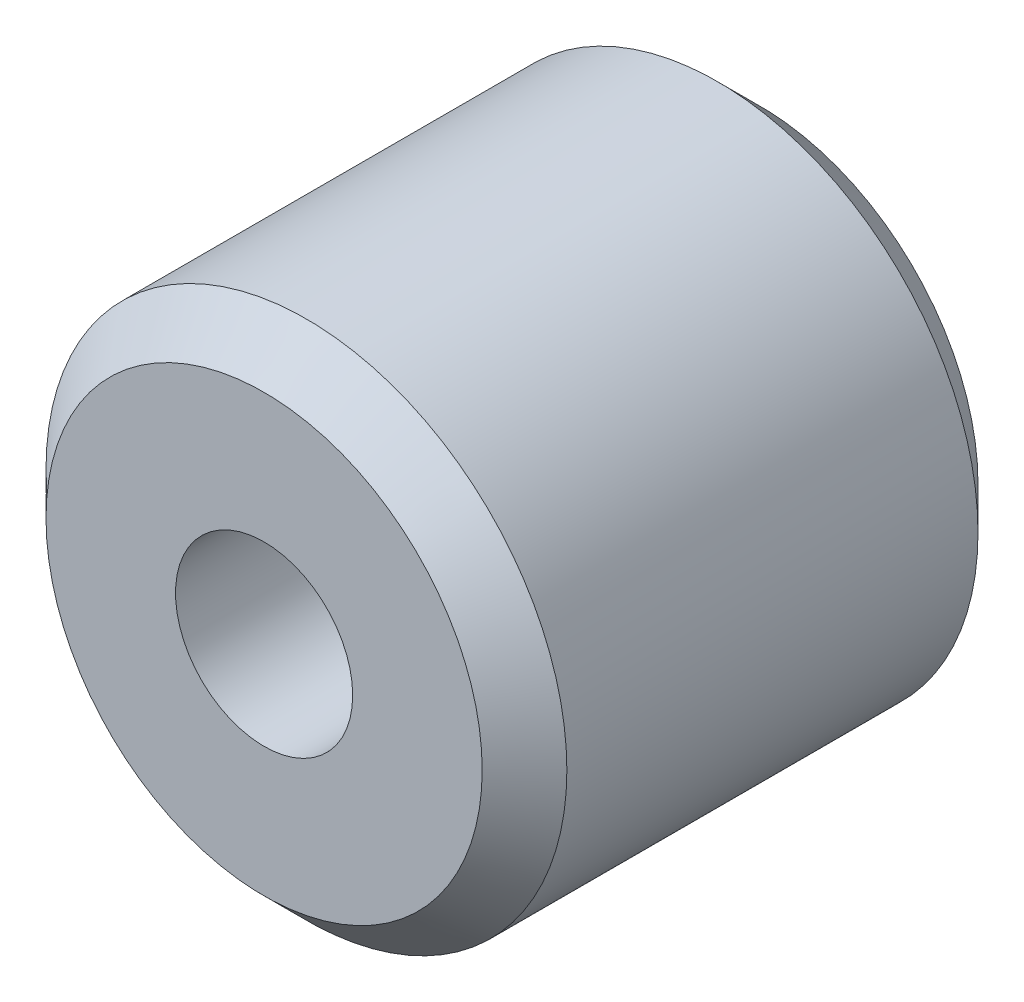
ISO-10303-21;
HEADER;
FILE_DESCRIPTION(('STEP AP214'),'2;1');
FILE_NAME('part.step','',(''),(''),'','','');
FILE_SCHEMA(('AUTOMOTIVE_DESIGN { 1 0 10303 214 1 1 1 1 }'));
ENDSEC;
DATA;
#1=APPLICATION_CONTEXT('core data for automotive mechanical design processes');
#2=APPLICATION_PROTOCOL_DEFINITION('international standard','automotive_design',2000,#1);
#3=PRODUCT_CONTEXT('',#1,'mechanical');
#4=PRODUCT('Part','Part','',(#3));
#5=PRODUCT_RELATED_PRODUCT_CATEGORY('part','',(#4));
#6=PRODUCT_DEFINITION_FORMATION('','',#4);
#7=PRODUCT_DEFINITION_CONTEXT('part definition',#1,'design');
#8=PRODUCT_DEFINITION('design','',#6,#7);
#9=PRODUCT_DEFINITION_SHAPE('','',#8);
#10=(LENGTH_UNIT() NAMED_UNIT(*) SI_UNIT(.MILLI.,.METRE.));
#11=(NAMED_UNIT(*) PLANE_ANGLE_UNIT() SI_UNIT($,.RADIAN.));
#12=(NAMED_UNIT(*) SI_UNIT($,.STERADIAN.) SOLID_ANGLE_UNIT());
#13=UNCERTAINTY_MEASURE_WITH_UNIT(LENGTH_MEASURE(1.E-05),#10,'distance_accuracy_value','');
#14=(GEOMETRIC_REPRESENTATION_CONTEXT(3) GLOBAL_UNCERTAINTY_ASSIGNED_CONTEXT((#13)) GLOBAL_UNIT_ASSIGNED_CONTEXT((#10,
#11,#12)) REPRESENTATION_CONTEXT('',''));
#15=CARTESIAN_POINT('',(0.,0.,0.));
#16=DIRECTION('',(0.,0.,1.));
#17=DIRECTION('',(1.,0.,0.));
#18=AXIS2_PLACEMENT_3D('',#15,#16,#17);
#19=CARTESIAN_POINT('',(0.,0.,4.45));
#20=DIRECTION('',(0.,0.,1.));
#21=DIRECTION('',(1.,0.,0.));
#22=AXIS2_PLACEMENT_3D('',#19,#20,#21);
#23=PLANE('',#22);
#24=CARTESIAN_POINT('',(0.,0.,4.45));
#25=DIRECTION('',(0.,0.,1.));
#26=DIRECTION('',(1.,0.,0.));
#27=AXIS2_PLACEMENT_3D('',#24,#25,#26);
#28=CIRCLE('',#27,3.915);
#29=CARTESIAN_POINT('',(3.915,0.,4.45));
#30=VERTEX_POINT('',#29);
#31=EDGE_CURVE('E10',#30,#30,#28,.T.);
#32=ORIENTED_EDGE('',*,*,#31,.T.);
#33=EDGE_LOOP('',(#32));
#34=FACE_BOUND('',#33,.T.);
#35=CARTESIAN_POINT('',(0.,0.,4.45));
#36=DIRECTION('',(0.,0.,1.));
#37=DIRECTION('',(1.,0.,0.));
#38=AXIS2_PLACEMENT_3D('',#35,#36,#37);
#39=CIRCLE('',#38,1.59);
#40=CARTESIAN_POINT('',(1.59,0.,4.45));
#41=VERTEX_POINT('',#40);
#42=EDGE_CURVE('E68',#41,#41,#39,.T.);
#43=ORIENTED_EDGE('',*,*,#42,.F.);
#44=EDGE_LOOP('',(#43));
#45=FACE_BOUND('',#44,.T.);
#46=ADVANCED_FACE('F43',(#34,#45),#23,.T.);
#47=CARTESIAN_POINT('',(0.,0.,-4.45));
#48=DIRECTION('',(0.,0.,1.));
#49=DIRECTION('',(1.,0.,0.));
#50=AXIS2_PLACEMENT_3D('',#47,#48,#49);
#51=PLANE('',#50);
#52=CARTESIAN_POINT('',(0.,0.,-4.45));
#53=DIRECTION('',(0.,0.,1.));
#54=DIRECTION('',(1.,0.,0.));
#55=AXIS2_PLACEMENT_3D('',#52,#53,#54);
#56=CIRCLE('',#55,3.91499999999999);
#57=CARTESIAN_POINT('',(3.91499999999999,0.,-4.45));
#58=VERTEX_POINT('',#57);
#59=EDGE_CURVE('E52',#58,#58,#56,.F.);
#60=ORIENTED_EDGE('',*,*,#59,.T.);
#61=EDGE_LOOP('',(#60));
#62=FACE_BOUND('',#61,.T.);
#63=CARTESIAN_POINT('',(0.,0.,-4.45));
#64=DIRECTION('',(0.,0.,1.));
#65=DIRECTION('',(1.,0.,0.));
#66=AXIS2_PLACEMENT_3D('',#63,#64,#65);
#67=CIRCLE('',#66,1.59);
#68=CARTESIAN_POINT('',(1.59,0.,-4.45));
#69=VERTEX_POINT('',#68);
#70=EDGE_CURVE('E69',#69,#69,#67,.T.);
#71=ORIENTED_EDGE('',*,*,#70,.T.);
#72=EDGE_LOOP('',(#71));
#73=FACE_BOUND('',#72,.T.);
#74=ADVANCED_FACE('F81',(#62,#73),#51,.F.);
#75=CARTESIAN_POINT('',(0.,0.,4.45));
#76=DIRECTION('',(0.,0.,-1.));
#77=DIRECTION('',(-1.,0.,0.));
#78=AXIS2_PLACEMENT_3D('',#75,#76,#77);
#79=CYLINDRICAL_SURFACE('',#78,4.675);
#80=CARTESIAN_POINT('',(0.,0.,-3.69));
#81=DIRECTION('',(0.,0.,1.));
#82=DIRECTION('',(1.,0.,0.));
#83=AXIS2_PLACEMENT_3D('',#80,#81,#82);
#84=CIRCLE('',#83,4.675);
#85=CARTESIAN_POINT('',(4.675,0.,-3.69));
#86=VERTEX_POINT('',#85);
#87=EDGE_CURVE('E57',#86,#86,#84,.T.);
#88=ORIENTED_EDGE('',*,*,#87,.T.);
#89=EDGE_LOOP('',(#88));
#90=FACE_BOUND('',#89,.T.);
#91=CARTESIAN_POINT('',(0.,0.,3.69));
#92=DIRECTION('',(0.,0.,1.));
#93=DIRECTION('',(1.,0.,0.));
#94=AXIS2_PLACEMENT_3D('',#91,#92,#93);
#95=CIRCLE('',#94,4.675);
#96=CARTESIAN_POINT('',(4.675,0.,3.69));
#97=VERTEX_POINT('',#96);
#98=EDGE_CURVE('E62',#97,#97,#95,.F.);
#99=ORIENTED_EDGE('',*,*,#98,.T.);
#100=EDGE_LOOP('',(#99));
#101=FACE_BOUND('',#100,.T.);
#102=ADVANCED_FACE('F86',(#90,#101),#79,.T.);
#103=CARTESIAN_POINT('',(0.,0.,4.45));
#104=DIRECTION('',(0.,0.,-1.));
#105=DIRECTION('',(-1.,0.,0.));
#106=AXIS2_PLACEMENT_3D('',#103,#104,#105);
#107=CYLINDRICAL_SURFACE('',#106,1.59);
#108=ORIENTED_EDGE('',*,*,#42,.T.);
#109=EDGE_LOOP('',(#108));
#110=FACE_BOUND('',#109,.T.);
#111=ORIENTED_EDGE('',*,*,#70,.F.);
#112=EDGE_LOOP('',(#111));
#113=FACE_BOUND('',#112,.T.);
#114=ADVANCED_FACE('F77',(#110,#113),#107,.F.);
#115=CARTESIAN_POINT('',(0.,0.,-3.69));
#116=DIRECTION('',(0.,0.,1.));
#117=DIRECTION('',(1.,0.,0.));
#118=AXIS2_PLACEMENT_3D('',#115,#116,#117);
#119=CONICAL_SURFACE('',#118,4.675,0.78539816339745);
#120=CARTESIAN_POINT('',(3.91499999999999,0.,-4.45));
#121=CARTESIAN_POINT('',(3.92291666666666,0.,-4.44208333333333));
#122=CARTESIAN_POINT('',(3.93083333333333,0.,-4.43416666666667));
#123=CARTESIAN_POINT('',(3.94666666666666,0.,-4.41833333333333));
#124=CARTESIAN_POINT('',(3.95458333333333,0.,-4.41041666666667));
#125=CARTESIAN_POINT('',(3.97041666666666,0.,-4.39458333333333));
#126=CARTESIAN_POINT('',(3.97833333333333,0.,-4.38666666666667));
#127=CARTESIAN_POINT('',(3.99416666666666,0.,-4.37083333333333));
#128=CARTESIAN_POINT('',(4.00208333333333,0.,-4.36291666666667));
#129=CARTESIAN_POINT('',(4.01791666666666,0.,-4.34708333333333));
#130=CARTESIAN_POINT('',(4.02583333333333,0.,-4.33916666666667));
#131=CARTESIAN_POINT('',(4.04166666666666,0.,-4.32333333333333));
#132=CARTESIAN_POINT('',(4.04958333333333,0.,-4.31541666666667));
#133=CARTESIAN_POINT('',(4.06541666666666,0.,-4.29958333333333));
#134=CARTESIAN_POINT('',(4.07333333333333,0.,-4.29166666666667));
#135=CARTESIAN_POINT('',(4.08916666666666,0.,-4.27583333333333));
#136=CARTESIAN_POINT('',(4.09708333333333,0.,-4.26791666666667));
#137=CARTESIAN_POINT('',(4.11291666666666,0.,-4.25208333333333));
#138=CARTESIAN_POINT('',(4.12083333333333,0.,-4.24416666666667));
#139=CARTESIAN_POINT('',(4.13666666666666,0.,-4.22833333333333));
#140=CARTESIAN_POINT('',(4.14458333333333,0.,-4.22041666666667));
#141=CARTESIAN_POINT('',(4.16041666666666,0.,-4.20458333333333));
#142=CARTESIAN_POINT('',(4.16833333333333,0.,-4.19666666666667));
#143=CARTESIAN_POINT('',(4.18416666666666,0.,-4.18083333333333));
#144=CARTESIAN_POINT('',(4.19208333333333,0.,-4.17291666666667));
#145=CARTESIAN_POINT('',(4.20791666666666,0.,-4.15708333333333));
#146=CARTESIAN_POINT('',(4.21583333333333,0.,-4.14916666666667));
#147=CARTESIAN_POINT('',(4.23166666666666,0.,-4.13333333333333));
#148=CARTESIAN_POINT('',(4.23958333333333,0.,-4.12541666666667));
#149=CARTESIAN_POINT('',(4.25541666666666,0.,-4.10958333333333));
#150=CARTESIAN_POINT('',(4.26333333333333,0.,-4.10166666666667));
#151=CARTESIAN_POINT('',(4.27916666666666,0.,-4.08583333333333));
#152=CARTESIAN_POINT('',(4.28708333333333,0.,-4.07791666666667));
#153=CARTESIAN_POINT('',(4.30291666666666,0.,-4.06208333333333));
#154=CARTESIAN_POINT('',(4.31083333333333,0.,-4.05416666666667));
#155=CARTESIAN_POINT('',(4.32666666666666,0.,-4.03833333333333));
#156=CARTESIAN_POINT('',(4.33458333333333,0.,-4.03041666666667));
#157=CARTESIAN_POINT('',(4.35041666666666,0.,-4.01458333333333));
#158=CARTESIAN_POINT('',(4.35833333333333,0.,-4.00666666666667));
#159=CARTESIAN_POINT('',(4.37416666666666,0.,-3.99083333333333));
#160=CARTESIAN_POINT('',(4.38208333333333,0.,-3.98291666666667));
#161=CARTESIAN_POINT('',(4.39791666666666,0.,-3.96708333333333));
#162=CARTESIAN_POINT('',(4.40583333333333,0.,-3.95916666666667));
#163=CARTESIAN_POINT('',(4.42166666666666,0.,-3.94333333333333));
#164=CARTESIAN_POINT('',(4.42958333333333,0.,-3.93541666666667));
#165=CARTESIAN_POINT('',(4.44541666666666,0.,-3.91958333333333));
#166=CARTESIAN_POINT('',(4.45333333333333,0.,-3.91166666666667));
#167=CARTESIAN_POINT('',(4.46916666666666,0.,-3.89583333333333));
#168=CARTESIAN_POINT('',(4.47708333333333,0.,-3.88791666666667));
#169=CARTESIAN_POINT('',(4.49291666666666,0.,-3.87208333333333));
#170=CARTESIAN_POINT('',(4.50083333333333,0.,-3.86416666666666));
#171=CARTESIAN_POINT('',(4.51666666666666,0.,-3.84833333333333));
#172=CARTESIAN_POINT('',(4.52458333333333,0.,-3.84041666666667));
#173=CARTESIAN_POINT('',(4.54041666666666,0.,-3.82458333333333));
#174=CARTESIAN_POINT('',(4.54833333333333,0.,-3.81666666666667));
#175=CARTESIAN_POINT('',(4.56416666666666,0.,-3.80083333333333));
#176=CARTESIAN_POINT('',(4.57208333333333,0.,-3.79291666666666));
#177=CARTESIAN_POINT('',(4.58791666666666,0.,-3.77708333333333));
#178=CARTESIAN_POINT('',(4.59583333333333,0.,-3.76916666666667));
#179=CARTESIAN_POINT('',(4.61166666666666,0.,-3.75333333333333));
#180=CARTESIAN_POINT('',(4.61958333333333,0.,-3.74541666666667));
#181=CARTESIAN_POINT('',(4.63541666666666,0.,-3.72958333333333));
#182=CARTESIAN_POINT('',(4.64333333333333,0.,-3.72166666666666));
#183=CARTESIAN_POINT('',(4.65916666666666,0.,-3.70583333333333));
#184=CARTESIAN_POINT('',(4.66708333333333,0.,-3.69791666666666));
#185=CARTESIAN_POINT('',(4.675,0.,-3.69));
#186=B_SPLINE_CURVE_WITH_KNOTS('',3,(#120,#121,#122,#123,#124,#125,#126,#127,#128,#129,#130,
#131,#132,#133,#134,#135,#136,#137,#138,#139,#140,#141,#142,#143,#144,#145,#146,#147,#148,#149,
#150,#151,#152,#153,#154,#155,#156,#157,#158,#159,#160,#161,#162,#163,#164,#165,#166,#167,#168,
#169,#170,#171,#172,#173,#174,#175,#176,#177,#178,#179,#180,#181,#182,#183,#184,#185),
.UNSPECIFIED.,.F.,.F.,(4,2,2,2,2,2,2,2,2,2,2,2,2,2,2,2,2,2,2,2,2,2,2,2,2,2,2,2,2,2,2,2,4),(0.,
0.0335875721063609,0.0671751442127223,0.100762716319084,0.134350288425444,0.167937860531806,
0.201525432638167,0.235113004744529,0.268700576850889,0.30228814895725,0.335875721063612,
0.369463293169973,0.403050865276334,0.436638437382695,0.470226009489056,0.503813581595417,
0.537401153701779,0.570988725808139,0.604576297914501,0.638163870020862,0.671751442127223,
0.705339014233584,0.738926586339945,0.772514158446306,0.806101730552668,0.839689302659028,
0.87327687476539,0.906864446871751,0.940452018978112,0.974039591084473,1.00762716319083,
1.0412147352972,1.07480230740356),.UNSPECIFIED.);
#187=EDGE_CURVE('BSEAM93',#58,#86,#186,.T.);
#188=ORIENTED_EDGE('',*,*,#59,.F.);
#189=ORIENTED_EDGE('',*,*,#87,.F.);
#190=ORIENTED_EDGE('',*,*,#187,.T.);
#191=ORIENTED_EDGE('',*,*,#187,.F.);
#192=EDGE_LOOP('',(#188,#190,#189,#191));
#193=FACE_BOUND('',#192,.T.);
#194=ADVANCED_FACE('F93',(#193),#119,.T.);
#195=CARTESIAN_POINT('',(0.,0.,4.45));
#196=DIRECTION('',(0.,0.,-1.));
#197=DIRECTION('',(-1.,0.,0.));
#198=AXIS2_PLACEMENT_3D('',#195,#196,#197);
#199=CONICAL_SURFACE('',#198,3.915,0.785398163397446);
#200=ORIENTED_EDGE('',*,*,#98,.F.);
#201=EDGE_LOOP('',(#200));
#202=FACE_BOUND('',#201,.T.);
#203=ORIENTED_EDGE('',*,*,#31,.F.);
#204=EDGE_LOOP('',(#203));
#205=FACE_BOUND('',#204,.T.);
#206=ADVANCED_FACE('F46',(#202,#205),#199,.T.);
#207=CLOSED_SHELL('',(#46,#74,#102,#114,#194,#206));
#208=MANIFOLD_SOLID_BREP('B2',#207);
#209=ADVANCED_BREP_SHAPE_REPRESENTATION('',(#18,#208),#14);
#210=SHAPE_DEFINITION_REPRESENTATION(#9,#209);
ENDSEC;
END-ISO-10303-21;
